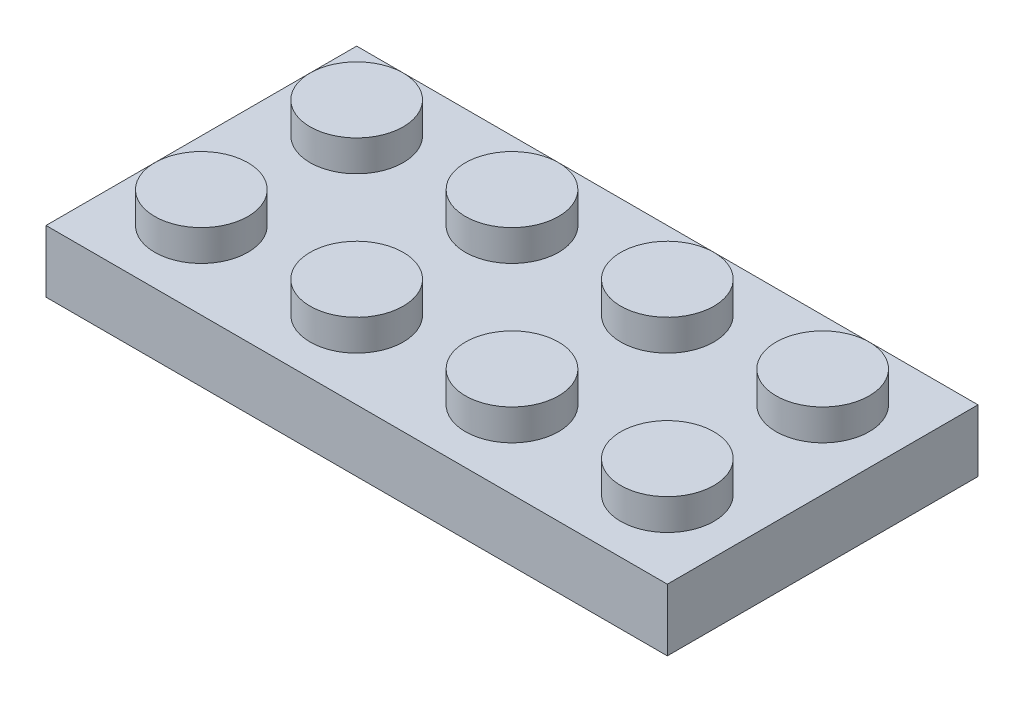
ISO-10303-21;
HEADER;
FILE_DESCRIPTION(('STEP AP214'),'2;1');
FILE_NAME('part.step','',(''),(''),'','','');
FILE_SCHEMA(('AUTOMOTIVE_DESIGN { 1 0 10303 214 1 1 1 1 }'));
ENDSEC;
DATA;
#1=APPLICATION_CONTEXT('core data for automotive mechanical design processes');
#2=APPLICATION_PROTOCOL_DEFINITION('international standard','automotive_design',2000,#1);
#3=PRODUCT_CONTEXT('',#1,'mechanical');
#4=PRODUCT('Part','Part','',(#3));
#5=PRODUCT_RELATED_PRODUCT_CATEGORY('part','',(#4));
#6=PRODUCT_DEFINITION_FORMATION('','',#4);
#7=PRODUCT_DEFINITION_CONTEXT('part definition',#1,'design');
#8=PRODUCT_DEFINITION('design','',#6,#7);
#9=PRODUCT_DEFINITION_SHAPE('','',#8);
#10=(LENGTH_UNIT() NAMED_UNIT(*) SI_UNIT(.MILLI.,.METRE.));
#11=(NAMED_UNIT(*) PLANE_ANGLE_UNIT() SI_UNIT($,.RADIAN.));
#12=(NAMED_UNIT(*) SI_UNIT($,.STERADIAN.) SOLID_ANGLE_UNIT());
#13=UNCERTAINTY_MEASURE_WITH_UNIT(LENGTH_MEASURE(1.E-05),#10,'distance_accuracy_value','');
#14=(GEOMETRIC_REPRESENTATION_CONTEXT(3) GLOBAL_UNCERTAINTY_ASSIGNED_CONTEXT((#13)) GLOBAL_UNIT_ASSIGNED_CONTEXT((#10,
#11,#12)) REPRESENTATION_CONTEXT('',''));
#15=CARTESIAN_POINT('',(0.,0.,0.));
#16=DIRECTION('',(0.,0.,1.));
#17=DIRECTION('',(1.,0.,0.));
#18=AXIS2_PLACEMENT_3D('',#15,#16,#17);
#19=CARTESIAN_POINT('',(28.,1.6,4.));
#20=DIRECTION('',(-1.,0.,0.));
#21=DIRECTION('',(0.,0.,1.));
#22=AXIS2_PLACEMENT_3D('',#19,#20,#21);
#23=PLANE('',#22);
#24=DIRECTION('',(0.,0.,-1.));
#25=VECTOR('',#24,1.);
#26=CARTESIAN_POINT('',(28.,0.,4.));
#27=LINE('',#26,#25);
#28=CARTESIAN_POINT('',(28.,0.,12.));
#29=VERTEX_POINT('',#28);
#30=CARTESIAN_POINT('',(28.,0.,-4.));
#31=VERTEX_POINT('',#30);
#32=EDGE_CURVE('E178',#29,#31,#27,.T.);
#33=ORIENTED_EDGE('',*,*,#32,.T.);
#34=DIRECTION('',(0.,-1.,0.));
#35=VECTOR('',#34,1.);
#36=CARTESIAN_POINT('',(28.,1.6,-4.));
#37=LINE('',#36,#35);
#38=CARTESIAN_POINT('',(28.,3.2,-4.));
#39=VERTEX_POINT('',#38);
#40=EDGE_CURVE('E202',#39,#31,#37,.T.);
#41=ORIENTED_EDGE('',*,*,#40,.F.);
#42=DIRECTION('',(0.,0.,-1.));
#43=VECTOR('',#42,1.);
#44=CARTESIAN_POINT('',(28.,3.2,4.));
#45=LINE('',#44,#43);
#46=CARTESIAN_POINT('',(28.,3.2,12.));
#47=VERTEX_POINT('',#46);
#48=EDGE_CURVE('E11',#47,#39,#45,.T.);
#49=ORIENTED_EDGE('',*,*,#48,.F.);
#50=DIRECTION('',(0.,1.,0.));
#51=VECTOR('',#50,1.);
#52=CARTESIAN_POINT('',(28.,1.6,12.));
#53=LINE('',#52,#51);
#54=EDGE_CURVE('E191',#29,#47,#53,.T.);
#55=ORIENTED_EDGE('',*,*,#54,.F.);
#56=EDGE_LOOP('',(#33,#41,#49,#55));
#57=FACE_BOUND('',#56,.T.);
#58=ADVANCED_FACE('F17',(#57),#23,.F.);
#59=CARTESIAN_POINT('',(12.,3.2,4.));
#60=DIRECTION('',(0.,-1.,0.));
#61=DIRECTION('',(0.,0.,-1.));
#62=AXIS2_PLACEMENT_3D('',#59,#60,#61);
#63=PLANE('',#62);
#64=ORIENTED_EDGE('',*,*,#48,.T.);
#65=DIRECTION('',(1.,0.,0.));
#66=VECTOR('',#65,1.);
#67=CARTESIAN_POINT('',(12.,3.2,-4.));
#68=LINE('',#67,#66);
#69=CARTESIAN_POINT('',(-4.,3.2,-4.));
#70=VERTEX_POINT('',#69);
#71=EDGE_CURVE('E21',#70,#39,#68,.T.);
#72=ORIENTED_EDGE('',*,*,#71,.F.);
#73=DIRECTION('',(0.,0.,-1.));
#74=VECTOR('',#73,1.);
#75=CARTESIAN_POINT('',(-4.,3.2,4.));
#76=LINE('',#75,#74);
#77=CARTESIAN_POINT('',(-4.,3.2,12.));
#78=VERTEX_POINT('',#77);
#79=EDGE_CURVE('E27',#78,#70,#76,.T.);
#80=ORIENTED_EDGE('',*,*,#79,.F.);
#81=DIRECTION('',(-1.,0.,0.));
#82=VECTOR('',#81,1.);
#83=CARTESIAN_POINT('',(12.,3.2,12.));
#84=LINE('',#83,#82);
#85=EDGE_CURVE('E174',#47,#78,#84,.T.);
#86=ORIENTED_EDGE('',*,*,#85,.F.);
#87=EDGE_LOOP('',(#64,#72,#80,#86));
#88=FACE_BOUND('',#87,.T.);
#89=CARTESIAN_POINT('',(0.,3.2,0.));
#90=DIRECTION('',(0.,-1.,0.));
#91=DIRECTION('',(1.,0.,0.));
#92=AXIS2_PLACEMENT_3D('',#89,#90,#91);
#93=CIRCLE('',#92,2.4);
#94=CARTESIAN_POINT('',(-2.4,3.2,0.));
#95=VERTEX_POINT('',#94);
#96=EDGE_CURVE('E193',#95,#95,#93,.T.);
#97=ORIENTED_EDGE('',*,*,#96,.T.);
#98=EDGE_LOOP('',(#97));
#99=FACE_BOUND('',#98,.T.);
#100=CARTESIAN_POINT('',(0.,3.2,8.));
#101=DIRECTION('',(0.,-1.,0.));
#102=DIRECTION('',(1.,0.,0.));
#103=AXIS2_PLACEMENT_3D('',#100,#101,#102);
#104=CIRCLE('',#103,2.4);
#105=CARTESIAN_POINT('',(-2.4,3.2,8.));
#106=VERTEX_POINT('',#105);
#107=EDGE_CURVE('E262',#106,#106,#104,.T.);
#108=ORIENTED_EDGE('',*,*,#107,.T.);
#109=EDGE_LOOP('',(#108));
#110=FACE_BOUND('',#109,.T.);
#111=CARTESIAN_POINT('',(8.,3.2,0.));
#112=DIRECTION('',(0.,-1.,0.));
#113=DIRECTION('',(1.,0.,0.));
#114=AXIS2_PLACEMENT_3D('',#111,#112,#113);
#115=CIRCLE('',#114,2.4);
#116=CARTESIAN_POINT('',(5.6,3.2,0.));
#117=VERTEX_POINT('',#116);
#118=EDGE_CURVE('E48',#117,#117,#115,.T.);
#119=ORIENTED_EDGE('',*,*,#118,.T.);
#120=EDGE_LOOP('',(#119));
#121=FACE_BOUND('',#120,.T.);
#122=CARTESIAN_POINT('',(8.,3.2,8.));
#123=DIRECTION('',(0.,-1.,0.));
#124=DIRECTION('',(1.,0.,0.));
#125=AXIS2_PLACEMENT_3D('',#122,#123,#124);
#126=CIRCLE('',#125,2.4);
#127=CARTESIAN_POINT('',(5.6,3.2,8.));
#128=VERTEX_POINT('',#127);
#129=EDGE_CURVE('E268',#128,#128,#126,.T.);
#130=ORIENTED_EDGE('',*,*,#129,.T.);
#131=EDGE_LOOP('',(#130));
#132=FACE_BOUND('',#131,.T.);
#133=CARTESIAN_POINT('',(16.,3.2,0.));
#134=DIRECTION('',(0.,-1.,0.));
#135=DIRECTION('',(1.,0.,0.));
#136=AXIS2_PLACEMENT_3D('',#133,#134,#135);
#137=CIRCLE('',#136,2.4);
#138=CARTESIAN_POINT('',(13.6,3.2,0.));
#139=VERTEX_POINT('',#138);
#140=EDGE_CURVE('E234',#139,#139,#137,.T.);
#141=ORIENTED_EDGE('',*,*,#140,.T.);
#142=EDGE_LOOP('',(#141));
#143=FACE_BOUND('',#142,.T.);
#144=CARTESIAN_POINT('',(16.,3.2,8.));
#145=DIRECTION('',(0.,-1.,0.));
#146=DIRECTION('',(1.,0.,0.));
#147=AXIS2_PLACEMENT_3D('',#144,#145,#146);
#148=CIRCLE('',#147,2.4);
#149=CARTESIAN_POINT('',(13.6,3.2,8.));
#150=VERTEX_POINT('',#149);
#151=EDGE_CURVE('E253',#150,#150,#148,.T.);
#152=ORIENTED_EDGE('',*,*,#151,.T.);
#153=EDGE_LOOP('',(#152));
#154=FACE_BOUND('',#153,.T.);
#155=CARTESIAN_POINT('',(24.,3.2,0.));
#156=DIRECTION('',(0.,-1.,0.));
#157=DIRECTION('',(1.,0.,0.));
#158=AXIS2_PLACEMENT_3D('',#155,#156,#157);
#159=CIRCLE('',#158,2.4);
#160=CARTESIAN_POINT('',(21.6,3.2,0.));
#161=VERTEX_POINT('',#160);
#162=EDGE_CURVE('E254',#161,#161,#159,.T.);
#163=ORIENTED_EDGE('',*,*,#162,.T.);
#164=EDGE_LOOP('',(#163));
#165=FACE_BOUND('',#164,.T.);
#166=CARTESIAN_POINT('',(24.,3.2,8.));
#167=DIRECTION('',(0.,-1.,0.));
#168=DIRECTION('',(1.,0.,0.));
#169=AXIS2_PLACEMENT_3D('',#166,#167,#168);
#170=CIRCLE('',#169,2.4);
#171=CARTESIAN_POINT('',(21.6,3.2,8.));
#172=VERTEX_POINT('',#171);
#173=EDGE_CURVE('E197',#172,#172,#170,.T.);
#174=ORIENTED_EDGE('',*,*,#173,.T.);
#175=EDGE_LOOP('',(#174));
#176=FACE_BOUND('',#175,.T.);
#177=ADVANCED_FACE('F171',(#88,#99,#110,#121,#132,#143,#154,#165,#176),#63,.F.);
#178=CARTESIAN_POINT('',(-4.,1.6,4.));
#179=DIRECTION('',(1.,0.,0.));
#180=DIRECTION('',(0.,0.,-1.));
#181=AXIS2_PLACEMENT_3D('',#178,#179,#180);
#182=PLANE('',#181);
#183=ORIENTED_EDGE('',*,*,#79,.T.);
#184=DIRECTION('',(0.,1.,0.));
#185=VECTOR('',#184,1.);
#186=CARTESIAN_POINT('',(-4.,1.6,-4.));
#187=LINE('',#186,#185);
#188=CARTESIAN_POINT('',(-4.,0.,-4.));
#189=VERTEX_POINT('',#188);
#190=EDGE_CURVE('E201',#189,#70,#187,.T.);
#191=ORIENTED_EDGE('',*,*,#190,.F.);
#192=DIRECTION('',(0.,0.,-1.));
#193=VECTOR('',#192,1.);
#194=CARTESIAN_POINT('',(-4.,0.,4.));
#195=LINE('',#194,#193);
#196=CARTESIAN_POINT('',(-4.,0.,12.));
#197=VERTEX_POINT('',#196);
#198=EDGE_CURVE('E183',#197,#189,#195,.T.);
#199=ORIENTED_EDGE('',*,*,#198,.F.);
#200=DIRECTION('',(0.,-1.,0.));
#201=VECTOR('',#200,1.);
#202=CARTESIAN_POINT('',(-4.,1.6,12.));
#203=LINE('',#202,#201);
#204=EDGE_CURVE('E181',#78,#197,#203,.T.);
#205=ORIENTED_EDGE('',*,*,#204,.F.);
#206=EDGE_LOOP('',(#183,#191,#199,#205));
#207=FACE_BOUND('',#206,.T.);
#208=ADVANCED_FACE('F182',(#207),#182,.F.);
#209=CARTESIAN_POINT('',(12.,0.,4.));
#210=DIRECTION('',(0.,1.,0.));
#211=DIRECTION('',(0.,0.,1.));
#212=AXIS2_PLACEMENT_3D('',#209,#210,#211);
#213=PLANE('',#212);
#214=ORIENTED_EDGE('',*,*,#198,.T.);
#215=DIRECTION('',(-1.,0.,0.));
#216=VECTOR('',#215,1.);
#217=CARTESIAN_POINT('',(12.,0.,-4.));
#218=LINE('',#217,#216);
#219=EDGE_CURVE('E199',#31,#189,#218,.T.);
#220=ORIENTED_EDGE('',*,*,#219,.F.);
#221=ORIENTED_EDGE('',*,*,#32,.F.);
#222=DIRECTION('',(1.,0.,0.));
#223=VECTOR('',#222,1.);
#224=CARTESIAN_POINT('',(12.,0.,12.));
#225=LINE('',#224,#223);
#226=EDGE_CURVE('E187',#197,#29,#225,.T.);
#227=ORIENTED_EDGE('',*,*,#226,.F.);
#228=EDGE_LOOP('',(#214,#220,#221,#227));
#229=FACE_BOUND('',#228,.T.);
#230=CARTESIAN_POINT('',(0.,0.,0.));
#231=DIRECTION('',(0.,1.,0.));
#232=DIRECTION('',(1.,0.,0.));
#233=AXIS2_PLACEMENT_3D('',#230,#231,#232);
#234=CIRCLE('',#233,2.4);
#235=CARTESIAN_POINT('',(-2.4,0.,0.));
#236=VERTEX_POINT('',#235);
#237=EDGE_CURVE('E226',#236,#236,#234,.T.);
#238=ORIENTED_EDGE('',*,*,#237,.T.);
#239=EDGE_LOOP('',(#238));
#240=FACE_BOUND('',#239,.T.);
#241=CARTESIAN_POINT('',(0.,0.,8.));
#242=DIRECTION('',(0.,1.,0.));
#243=DIRECTION('',(1.,0.,0.));
#244=AXIS2_PLACEMENT_3D('',#241,#242,#243);
#245=CIRCLE('',#244,2.4);
#246=CARTESIAN_POINT('',(-2.4,0.,8.));
#247=VERTEX_POINT('',#246);
#248=EDGE_CURVE('E222',#247,#247,#245,.T.);
#249=ORIENTED_EDGE('',*,*,#248,.T.);
#250=EDGE_LOOP('',(#249));
#251=FACE_BOUND('',#250,.T.);
#252=CARTESIAN_POINT('',(8.,0.,0.));
#253=DIRECTION('',(0.,1.,0.));
#254=DIRECTION('',(1.,0.,0.));
#255=AXIS2_PLACEMENT_3D('',#252,#253,#254);
#256=CIRCLE('',#255,2.4);
#257=CARTESIAN_POINT('',(5.6,0.,0.));
#258=VERTEX_POINT('',#257);
#259=EDGE_CURVE('E265',#258,#258,#256,.T.);
#260=ORIENTED_EDGE('',*,*,#259,.T.);
#261=EDGE_LOOP('',(#260));
#262=FACE_BOUND('',#261,.T.);
#263=CARTESIAN_POINT('',(8.,0.,8.));
#264=DIRECTION('',(0.,1.,0.));
#265=DIRECTION('',(1.,0.,0.));
#266=AXIS2_PLACEMENT_3D('',#263,#264,#265);
#267=CIRCLE('',#266,2.4);
#268=CARTESIAN_POINT('',(5.6,0.,8.));
#269=VERTEX_POINT('',#268);
#270=EDGE_CURVE('E210',#269,#269,#267,.T.);
#271=ORIENTED_EDGE('',*,*,#270,.T.);
#272=EDGE_LOOP('',(#271));
#273=FACE_BOUND('',#272,.T.);
#274=CARTESIAN_POINT('',(16.,0.,0.));
#275=DIRECTION('',(0.,1.,0.));
#276=DIRECTION('',(1.,0.,0.));
#277=AXIS2_PLACEMENT_3D('',#274,#275,#276);
#278=CIRCLE('',#277,2.4);
#279=CARTESIAN_POINT('',(13.6,0.,0.));
#280=VERTEX_POINT('',#279);
#281=EDGE_CURVE('E211',#280,#280,#278,.T.);
#282=ORIENTED_EDGE('',*,*,#281,.T.);
#283=EDGE_LOOP('',(#282));
#284=FACE_BOUND('',#283,.T.);
#285=CARTESIAN_POINT('',(16.,0.,8.));
#286=DIRECTION('',(0.,1.,0.));
#287=DIRECTION('',(1.,0.,0.));
#288=AXIS2_PLACEMENT_3D('',#285,#286,#287);
#289=CIRCLE('',#288,2.4);
#290=CARTESIAN_POINT('',(13.6,0.,8.));
#291=VERTEX_POINT('',#290);
#292=EDGE_CURVE('E204',#291,#291,#289,.T.);
#293=ORIENTED_EDGE('',*,*,#292,.T.);
#294=EDGE_LOOP('',(#293));
#295=FACE_BOUND('',#294,.T.);
#296=CARTESIAN_POINT('',(24.,0.,0.));
#297=DIRECTION('',(0.,1.,0.));
#298=DIRECTION('',(1.,0.,0.));
#299=AXIS2_PLACEMENT_3D('',#296,#297,#298);
#300=CIRCLE('',#299,2.4);
#301=CARTESIAN_POINT('',(21.6,0.,0.));
#302=VERTEX_POINT('',#301);
#303=EDGE_CURVE('E250',#302,#302,#300,.T.);
#304=ORIENTED_EDGE('',*,*,#303,.T.);
#305=EDGE_LOOP('',(#304));
#306=FACE_BOUND('',#305,.T.);
#307=CARTESIAN_POINT('',(24.,0.,8.));
#308=DIRECTION('',(0.,1.,0.));
#309=DIRECTION('',(1.,0.,0.));
#310=AXIS2_PLACEMENT_3D('',#307,#308,#309);
#311=CIRCLE('',#310,2.4);
#312=CARTESIAN_POINT('',(21.6,0.,8.));
#313=VERTEX_POINT('',#312);
#314=EDGE_CURVE('E230',#313,#313,#311,.T.);
#315=ORIENTED_EDGE('',*,*,#314,.T.);
#316=EDGE_LOOP('',(#315));
#317=FACE_BOUND('',#316,.T.);
#318=CARTESIAN_POINT('',(4.,0.,4.));
#319=DIRECTION('',(0.,1.,0.));
#320=DIRECTION('',(1.,0.,0.));
#321=AXIS2_PLACEMENT_3D('',#318,#319,#320);
#322=CIRCLE('',#321,2.4);
#323=CARTESIAN_POINT('',(1.6,0.,4.));
#324=VERTEX_POINT('',#323);
#325=EDGE_CURVE('E216',#324,#324,#322,.T.);
#326=ORIENTED_EDGE('',*,*,#325,.T.);
#327=EDGE_LOOP('',(#326));
#328=FACE_BOUND('',#327,.T.);
#329=CARTESIAN_POINT('',(12.,0.,4.));
#330=DIRECTION('',(0.,1.,0.));
#331=DIRECTION('',(1.,0.,0.));
#332=AXIS2_PLACEMENT_3D('',#329,#330,#331);
#333=CIRCLE('',#332,2.4);
#334=CARTESIAN_POINT('',(9.6,0.,4.));
#335=VERTEX_POINT('',#334);
#336=EDGE_CURVE('E212',#335,#335,#333,.T.);
#337=ORIENTED_EDGE('',*,*,#336,.T.);
#338=EDGE_LOOP('',(#337));
#339=FACE_BOUND('',#338,.T.);
#340=CARTESIAN_POINT('',(20.,0.,4.));
#341=DIRECTION('',(0.,1.,0.));
#342=DIRECTION('',(1.,0.,0.));
#343=AXIS2_PLACEMENT_3D('',#340,#341,#342);
#344=CIRCLE('',#343,2.4);
#345=CARTESIAN_POINT('',(17.6,0.,4.));
#346=VERTEX_POINT('',#345);
#347=EDGE_CURVE('E257',#346,#346,#344,.T.);
#348=ORIENTED_EDGE('',*,*,#347,.T.);
#349=EDGE_LOOP('',(#348));
#350=FACE_BOUND('',#349,.T.);
#351=ADVANCED_FACE('F390',(#229,#240,#251,#262,#273,#284,#295,#306,#317,#328,#339,#350),#213,.F.);
#352=CARTESIAN_POINT('',(12.,1.6,-4.));
#353=DIRECTION('',(0.,0.,1.));
#354=DIRECTION('',(1.,0.,0.));
#355=AXIS2_PLACEMENT_3D('',#352,#353,#354);
#356=PLANE('',#355);
#357=ORIENTED_EDGE('',*,*,#40,.T.);
#358=ORIENTED_EDGE('',*,*,#219,.T.);
#359=ORIENTED_EDGE('',*,*,#190,.T.);
#360=ORIENTED_EDGE('',*,*,#71,.T.);
#361=EDGE_LOOP('',(#357,#358,#359,#360));
#362=FACE_BOUND('',#361,.T.);
#363=ADVANCED_FACE('F393',(#362),#356,.F.);
#364=CARTESIAN_POINT('',(12.,1.6,12.));
#365=DIRECTION('',(0.,0.,1.));
#366=DIRECTION('',(1.,0.,0.));
#367=AXIS2_PLACEMENT_3D('',#364,#365,#366);
#368=PLANE('',#367);
#369=ORIENTED_EDGE('',*,*,#54,.T.);
#370=ORIENTED_EDGE('',*,*,#85,.T.);
#371=ORIENTED_EDGE('',*,*,#204,.T.);
#372=ORIENTED_EDGE('',*,*,#226,.T.);
#373=EDGE_LOOP('',(#369,#370,#371,#372));
#374=FACE_BOUND('',#373,.T.);
#375=ADVANCED_FACE('F189',(#374),#368,.T.);
#376=CARTESIAN_POINT('',(0.,4.8,0.));
#377=DIRECTION('',(0.,1.,0.));
#378=DIRECTION('',(1.,0.,0.));
#379=AXIS2_PLACEMENT_3D('',#376,#377,#378);
#380=PLANE('',#379);
#381=CARTESIAN_POINT('',(0.,4.8,0.));
#382=DIRECTION('',(0.,1.,0.));
#383=DIRECTION('',(1.,0.,0.));
#384=AXIS2_PLACEMENT_3D('',#381,#382,#383);
#385=CIRCLE('',#384,2.4);
#386=CARTESIAN_POINT('',(2.4,4.8,0.));
#387=VERTEX_POINT('',#386);
#388=EDGE_CURVE('E261',#387,#387,#385,.T.);
#389=ORIENTED_EDGE('',*,*,#388,.T.);
#390=EDGE_LOOP('',(#389));
#391=FACE_BOUND('',#390,.T.);
#392=ADVANCED_FACE('F451',(#391),#380,.T.);
#393=CARTESIAN_POINT('',(0.,3.75,0.));
#394=DIRECTION('',(0.,-1.,0.));
#395=DIRECTION('',(1.,0.,0.));
#396=AXIS2_PLACEMENT_3D('',#393,#394,#395);
#397=CYLINDRICAL_SURFACE('',#396,2.4);
#398=ORIENTED_EDGE('',*,*,#96,.F.);
#399=EDGE_LOOP('',(#398));
#400=FACE_BOUND('',#399,.T.);
#401=ORIENTED_EDGE('',*,*,#388,.F.);
#402=EDGE_LOOP('',(#401));
#403=FACE_BOUND('',#402,.T.);
#404=ADVANCED_FACE('F454',(#400,#403),#397,.T.);
#405=CARTESIAN_POINT('',(0.,4.8,8.));
#406=DIRECTION('',(0.,1.,0.));
#407=DIRECTION('',(1.,0.,0.));
#408=AXIS2_PLACEMENT_3D('',#405,#406,#407);
#409=PLANE('',#408);
#410=CARTESIAN_POINT('',(0.,4.8,8.));
#411=DIRECTION('',(0.,1.,0.));
#412=DIRECTION('',(1.,0.,0.));
#413=AXIS2_PLACEMENT_3D('',#410,#411,#412);
#414=CIRCLE('',#413,2.4);
#415=CARTESIAN_POINT('',(2.4,4.8,8.));
#416=VERTEX_POINT('',#415);
#417=EDGE_CURVE('E247',#416,#416,#414,.T.);
#418=ORIENTED_EDGE('',*,*,#417,.T.);
#419=EDGE_LOOP('',(#418));
#420=FACE_BOUND('',#419,.T.);
#421=ADVANCED_FACE('F449',(#420),#409,.T.);
#422=CARTESIAN_POINT('',(0.,3.75,8.));
#423=DIRECTION('',(0.,-1.,0.));
#424=DIRECTION('',(1.,0.,0.));
#425=AXIS2_PLACEMENT_3D('',#422,#423,#424);
#426=CYLINDRICAL_SURFACE('',#425,2.4);
#427=ORIENTED_EDGE('',*,*,#107,.F.);
#428=EDGE_LOOP('',(#427));
#429=FACE_BOUND('',#428,.T.);
#430=ORIENTED_EDGE('',*,*,#417,.F.);
#431=EDGE_LOOP('',(#430));
#432=FACE_BOUND('',#431,.T.);
#433=ADVANCED_FACE('F368',(#429,#432),#426,.T.);
#434=CARTESIAN_POINT('',(8.,4.8,0.));
#435=DIRECTION('',(0.,1.,0.));
#436=DIRECTION('',(1.,0.,0.));
#437=AXIS2_PLACEMENT_3D('',#434,#435,#436);
#438=PLANE('',#437);
#439=CARTESIAN_POINT('',(8.,4.8,0.));
#440=DIRECTION('',(0.,1.,0.));
#441=DIRECTION('',(1.,0.,0.));
#442=AXIS2_PLACEMENT_3D('',#439,#440,#441);
#443=CIRCLE('',#442,2.4);
#444=CARTESIAN_POINT('',(10.4,4.8,0.));
#445=VERTEX_POINT('',#444);
#446=EDGE_CURVE('E57',#445,#445,#443,.T.);
#447=ORIENTED_EDGE('',*,*,#446,.T.);
#448=EDGE_LOOP('',(#447));
#449=FACE_BOUND('',#448,.T.);
#450=ADVANCED_FACE('F360',(#449),#438,.T.);
#451=CARTESIAN_POINT('',(8.,3.75,0.));
#452=DIRECTION('',(0.,-1.,0.));
#453=DIRECTION('',(1.,0.,0.));
#454=AXIS2_PLACEMENT_3D('',#451,#452,#453);
#455=CYLINDRICAL_SURFACE('',#454,2.4);
#456=ORIENTED_EDGE('',*,*,#118,.F.);
#457=EDGE_LOOP('',(#456));
#458=FACE_BOUND('',#457,.T.);
#459=ORIENTED_EDGE('',*,*,#446,.F.);
#460=EDGE_LOOP('',(#459));
#461=FACE_BOUND('',#460,.T.);
#462=ADVANCED_FACE('F352',(#458,#461),#455,.T.);
#463=CARTESIAN_POINT('',(8.,4.8,8.));
#464=DIRECTION('',(0.,1.,0.));
#465=DIRECTION('',(1.,0.,0.));
#466=AXIS2_PLACEMENT_3D('',#463,#464,#465);
#467=PLANE('',#466);
#468=CARTESIAN_POINT('',(8.,4.8,8.));
#469=DIRECTION('',(0.,1.,0.));
#470=DIRECTION('',(1.,0.,0.));
#471=AXIS2_PLACEMENT_3D('',#468,#469,#470);
#472=CIRCLE('',#471,2.4);
#473=CARTESIAN_POINT('',(10.4,4.8,8.));
#474=VERTEX_POINT('',#473);
#475=EDGE_CURVE('E235',#474,#474,#472,.T.);
#476=ORIENTED_EDGE('',*,*,#475,.T.);
#477=EDGE_LOOP('',(#476));
#478=FACE_BOUND('',#477,.T.);
#479=ADVANCED_FACE('F349',(#478),#467,.T.);
#480=CARTESIAN_POINT('',(8.,3.75,8.));
#481=DIRECTION('',(0.,-1.,0.));
#482=DIRECTION('',(1.,0.,0.));
#483=AXIS2_PLACEMENT_3D('',#480,#481,#482);
#484=CYLINDRICAL_SURFACE('',#483,2.4);
#485=ORIENTED_EDGE('',*,*,#129,.F.);
#486=EDGE_LOOP('',(#485));
#487=FACE_BOUND('',#486,.T.);
#488=ORIENTED_EDGE('',*,*,#475,.F.);
#489=EDGE_LOOP('',(#488));
#490=FACE_BOUND('',#489,.T.);
#491=ADVANCED_FACE('F351',(#487,#490),#484,.T.);
#492=CARTESIAN_POINT('',(16.,4.8,0.));
#493=DIRECTION('',(0.,1.,0.));
#494=DIRECTION('',(1.,0.,0.));
#495=AXIS2_PLACEMENT_3D('',#492,#493,#494);
#496=PLANE('',#495);
#497=CARTESIAN_POINT('',(16.,4.8,0.));
#498=DIRECTION('',(0.,1.,0.));
#499=DIRECTION('',(1.,0.,0.));
#500=AXIS2_PLACEMENT_3D('',#497,#498,#499);
#501=CIRCLE('',#500,2.4);
#502=CARTESIAN_POINT('',(18.4,4.8,0.));
#503=VERTEX_POINT('',#502);
#504=EDGE_CURVE('E236',#503,#503,#501,.T.);
#505=ORIENTED_EDGE('',*,*,#504,.T.);
#506=EDGE_LOOP('',(#505));
#507=FACE_BOUND('',#506,.T.);
#508=ADVANCED_FACE('F309',(#507),#496,.T.);
#509=CARTESIAN_POINT('',(16.,3.75,0.));
#510=DIRECTION('',(0.,-1.,0.));
#511=DIRECTION('',(1.,0.,0.));
#512=AXIS2_PLACEMENT_3D('',#509,#510,#511);
#513=CYLINDRICAL_SURFACE('',#512,2.4);
#514=ORIENTED_EDGE('',*,*,#140,.F.);
#515=EDGE_LOOP('',(#514));
#516=FACE_BOUND('',#515,.T.);
#517=ORIENTED_EDGE('',*,*,#504,.F.);
#518=EDGE_LOOP('',(#517));
#519=FACE_BOUND('',#518,.T.);
#520=ADVANCED_FACE('F321',(#516,#519),#513,.T.);
#521=CARTESIAN_POINT('',(16.,4.8,8.));
#522=DIRECTION('',(0.,1.,0.));
#523=DIRECTION('',(1.,0.,0.));
#524=AXIS2_PLACEMENT_3D('',#521,#522,#523);
#525=PLANE('',#524);
#526=CARTESIAN_POINT('',(16.,4.8,8.));
#527=DIRECTION('',(0.,1.,0.));
#528=DIRECTION('',(1.,0.,0.));
#529=AXIS2_PLACEMENT_3D('',#526,#527,#528);
#530=CIRCLE('',#529,2.4);
#531=CARTESIAN_POINT('',(18.4,4.8,8.));
#532=VERTEX_POINT('',#531);
#533=EDGE_CURVE('E251',#532,#532,#530,.T.);
#534=ORIENTED_EDGE('',*,*,#533,.T.);
#535=EDGE_LOOP('',(#534));
#536=FACE_BOUND('',#535,.T.);
#537=ADVANCED_FACE('F317',(#536),#525,.T.);
#538=CARTESIAN_POINT('',(16.,3.75,8.));
#539=DIRECTION('',(0.,-1.,0.));
#540=DIRECTION('',(1.,0.,0.));
#541=AXIS2_PLACEMENT_3D('',#538,#539,#540);
#542=CYLINDRICAL_SURFACE('',#541,2.4);
#543=ORIENTED_EDGE('',*,*,#151,.F.);
#544=EDGE_LOOP('',(#543));
#545=FACE_BOUND('',#544,.T.);
#546=ORIENTED_EDGE('',*,*,#533,.F.);
#547=EDGE_LOOP('',(#546));
#548=FACE_BOUND('',#547,.T.);
#549=ADVANCED_FACE('F320',(#545,#548),#542,.T.);
#550=CARTESIAN_POINT('',(24.,4.8,0.));
#551=DIRECTION('',(0.,1.,0.));
#552=DIRECTION('',(1.,0.,0.));
#553=AXIS2_PLACEMENT_3D('',#550,#551,#552);
#554=PLANE('',#553);
#555=CARTESIAN_POINT('',(24.,4.8,0.));
#556=DIRECTION('',(0.,1.,0.));
#557=DIRECTION('',(1.,0.,0.));
#558=AXIS2_PLACEMENT_3D('',#555,#556,#557);
#559=CIRCLE('',#558,2.4);
#560=CARTESIAN_POINT('',(26.4,4.8,0.));
#561=VERTEX_POINT('',#560);
#562=EDGE_CURVE('E243',#561,#561,#559,.T.);
#563=ORIENTED_EDGE('',*,*,#562,.T.);
#564=EDGE_LOOP('',(#563));
#565=FACE_BOUND('',#564,.T.);
#566=ADVANCED_FACE('F323',(#565),#554,.T.);
#567=CARTESIAN_POINT('',(24.,3.75,0.));
#568=DIRECTION('',(0.,-1.,0.));
#569=DIRECTION('',(1.,0.,0.));
#570=AXIS2_PLACEMENT_3D('',#567,#568,#569);
#571=CYLINDRICAL_SURFACE('',#570,2.4);
#572=ORIENTED_EDGE('',*,*,#162,.F.);
#573=EDGE_LOOP('',(#572));
#574=FACE_BOUND('',#573,.T.);
#575=ORIENTED_EDGE('',*,*,#562,.F.);
#576=EDGE_LOOP('',(#575));
#577=FACE_BOUND('',#576,.T.);
#578=ADVANCED_FACE('F325',(#574,#577),#571,.T.);
#579=CARTESIAN_POINT('',(24.,4.8,8.));
#580=DIRECTION('',(0.,1.,0.));
#581=DIRECTION('',(1.,0.,0.));
#582=AXIS2_PLACEMENT_3D('',#579,#580,#581);
#583=PLANE('',#582);
#584=CARTESIAN_POINT('',(24.,4.8,8.));
#585=DIRECTION('',(0.,1.,0.));
#586=DIRECTION('',(1.,0.,0.));
#587=AXIS2_PLACEMENT_3D('',#584,#585,#586);
#588=CIRCLE('',#587,2.4);
#589=CARTESIAN_POINT('',(26.4,4.8,8.));
#590=VERTEX_POINT('',#589);
#591=EDGE_CURVE('E237',#590,#590,#588,.T.);
#592=ORIENTED_EDGE('',*,*,#591,.T.);
#593=EDGE_LOOP('',(#592));
#594=FACE_BOUND('',#593,.T.);
#595=ADVANCED_FACE('F428',(#594),#583,.T.);
#596=CARTESIAN_POINT('',(24.,3.75,8.));
#597=DIRECTION('',(0.,-1.,0.));
#598=DIRECTION('',(1.,0.,0.));
#599=AXIS2_PLACEMENT_3D('',#596,#597,#598);
#600=CYLINDRICAL_SURFACE('',#599,2.4);
#601=ORIENTED_EDGE('',*,*,#173,.F.);
#602=EDGE_LOOP('',(#601));
#603=FACE_BOUND('',#602,.T.);
#604=ORIENTED_EDGE('',*,*,#591,.F.);
#605=EDGE_LOOP('',(#604));
#606=FACE_BOUND('',#605,.T.);
#607=ADVANCED_FACE('F347',(#603,#606),#600,.T.);
#608=CARTESIAN_POINT('',(0.,1.6,0.));
#609=DIRECTION('',(0.,1.,0.));
#610=DIRECTION('',(1.,0.,0.));
#611=AXIS2_PLACEMENT_3D('',#608,#609,#610);
#612=PLANE('',#611);
#613=CARTESIAN_POINT('',(0.,1.6,0.));
#614=DIRECTION('',(0.,1.,0.));
#615=DIRECTION('',(1.,0.,0.));
#616=AXIS2_PLACEMENT_3D('',#613,#614,#615);
#617=CIRCLE('',#616,2.4);
#618=CARTESIAN_POINT('',(2.4,1.6,0.));
#619=VERTEX_POINT('',#618);
#620=EDGE_CURVE('E228',#619,#619,#617,.T.);
#621=ORIENTED_EDGE('',*,*,#620,.F.);
#622=EDGE_LOOP('',(#621));
#623=FACE_BOUND('',#622,.T.);
#624=ADVANCED_FACE('F344',(#623),#612,.F.);
#625=CARTESIAN_POINT('',(0.,0.55,0.));
#626=DIRECTION('',(0.,-1.,0.));
#627=DIRECTION('',(1.,0.,0.));
#628=AXIS2_PLACEMENT_3D('',#625,#626,#627);
#629=CYLINDRICAL_SURFACE('',#628,2.4);
#630=ORIENTED_EDGE('',*,*,#620,.T.);
#631=EDGE_LOOP('',(#630));
#632=FACE_BOUND('',#631,.T.);
#633=ORIENTED_EDGE('',*,*,#237,.F.);
#634=EDGE_LOOP('',(#633));
#635=FACE_BOUND('',#634,.T.);
#636=ADVANCED_FACE('F346',(#632,#635),#629,.F.);
#637=CARTESIAN_POINT('',(0.,1.6,8.));
#638=DIRECTION('',(0.,1.,0.));
#639=DIRECTION('',(1.,0.,0.));
#640=AXIS2_PLACEMENT_3D('',#637,#638,#639);
#641=PLANE('',#640);
#642=CARTESIAN_POINT('',(0.,1.6,8.));
#643=DIRECTION('',(0.,1.,0.));
#644=DIRECTION('',(1.,0.,0.));
#645=AXIS2_PLACEMENT_3D('',#642,#643,#644);
#646=CIRCLE('',#645,2.4);
#647=CARTESIAN_POINT('',(2.4,1.6,8.));
#648=VERTEX_POINT('',#647);
#649=EDGE_CURVE('E224',#648,#648,#646,.T.);
#650=ORIENTED_EDGE('',*,*,#649,.F.);
#651=EDGE_LOOP('',(#650));
#652=FACE_BOUND('',#651,.T.);
#653=ADVANCED_FACE('F342',(#652),#641,.F.);
#654=CARTESIAN_POINT('',(0.,0.55,8.));
#655=DIRECTION('',(0.,-1.,0.));
#656=DIRECTION('',(1.,0.,0.));
#657=AXIS2_PLACEMENT_3D('',#654,#655,#656);
#658=CYLINDRICAL_SURFACE('',#657,2.4);
#659=ORIENTED_EDGE('',*,*,#649,.T.);
#660=EDGE_LOOP('',(#659));
#661=FACE_BOUND('',#660,.T.);
#662=ORIENTED_EDGE('',*,*,#248,.F.);
#663=EDGE_LOOP('',(#662));
#664=FACE_BOUND('',#663,.T.);
#665=ADVANCED_FACE('F338',(#661,#664),#658,.F.);
#666=CARTESIAN_POINT('',(8.,1.6,0.));
#667=DIRECTION('',(0.,1.,0.));
#668=DIRECTION('',(1.,0.,0.));
#669=AXIS2_PLACEMENT_3D('',#666,#667,#668);
#670=PLANE('',#669);
#671=CARTESIAN_POINT('',(8.,1.6,0.));
#672=DIRECTION('',(0.,1.,0.));
#673=DIRECTION('',(1.,0.,0.));
#674=AXIS2_PLACEMENT_3D('',#671,#672,#673);
#675=CIRCLE('',#674,2.4);
#676=CARTESIAN_POINT('',(10.4,1.6,0.));
#677=VERTEX_POINT('',#676);
#678=EDGE_CURVE('E225',#677,#677,#675,.T.);
#679=ORIENTED_EDGE('',*,*,#678,.F.);
#680=EDGE_LOOP('',(#679));
#681=FACE_BOUND('',#680,.T.);
#682=ADVANCED_FACE('F341',(#681),#670,.F.);
#683=CARTESIAN_POINT('',(8.,0.55,0.));
#684=DIRECTION('',(0.,-1.,0.));
#685=DIRECTION('',(1.,0.,0.));
#686=AXIS2_PLACEMENT_3D('',#683,#684,#685);
#687=CYLINDRICAL_SURFACE('',#686,2.4);
#688=ORIENTED_EDGE('',*,*,#678,.T.);
#689=EDGE_LOOP('',(#688));
#690=FACE_BOUND('',#689,.T.);
#691=ORIENTED_EDGE('',*,*,#259,.F.);
#692=EDGE_LOOP('',(#691));
#693=FACE_BOUND('',#692,.T.);
#694=ADVANCED_FACE('F431',(#690,#693),#687,.F.);
#695=CARTESIAN_POINT('',(8.,1.6,8.));
#696=DIRECTION('',(0.,1.,0.));
#697=DIRECTION('',(1.,0.,0.));
#698=AXIS2_PLACEMENT_3D('',#695,#696,#697);
#699=PLANE('',#698);
#700=CARTESIAN_POINT('',(8.,1.6,8.));
#701=DIRECTION('',(0.,1.,0.));
#702=DIRECTION('',(1.,0.,0.));
#703=AXIS2_PLACEMENT_3D('',#700,#701,#702);
#704=CIRCLE('',#703,2.4);
#705=CARTESIAN_POINT('',(10.4,1.6,8.));
#706=VERTEX_POINT('',#705);
#707=EDGE_CURVE('E221',#706,#706,#704,.T.);
#708=ORIENTED_EDGE('',*,*,#707,.F.);
#709=EDGE_LOOP('',(#708));
#710=FACE_BOUND('',#709,.T.);
#711=ADVANCED_FACE('F436',(#710),#699,.F.);
#712=CARTESIAN_POINT('',(8.,0.55,8.));
#713=DIRECTION('',(0.,-1.,0.));
#714=DIRECTION('',(1.,0.,0.));
#715=AXIS2_PLACEMENT_3D('',#712,#713,#714);
#716=CYLINDRICAL_SURFACE('',#715,2.4);
#717=ORIENTED_EDGE('',*,*,#707,.T.);
#718=EDGE_LOOP('',(#717));
#719=FACE_BOUND('',#718,.T.);
#720=ORIENTED_EDGE('',*,*,#270,.F.);
#721=EDGE_LOOP('',(#720));
#722=FACE_BOUND('',#721,.T.);
#723=ADVANCED_FACE('F443',(#719,#722),#716,.F.);
#724=CARTESIAN_POINT('',(16.,1.6,0.));
#725=DIRECTION('',(0.,1.,0.));
#726=DIRECTION('',(1.,0.,0.));
#727=AXIS2_PLACEMENT_3D('',#724,#725,#726);
#728=PLANE('',#727);
#729=CARTESIAN_POINT('',(16.,1.6,0.));
#730=DIRECTION('',(0.,1.,0.));
#731=DIRECTION('',(1.,0.,0.));
#732=AXIS2_PLACEMENT_3D('',#729,#730,#731);
#733=CIRCLE('',#732,2.4);
#734=CARTESIAN_POINT('',(18.4,1.6,0.));
#735=VERTEX_POINT('',#734);
#736=EDGE_CURVE('E208',#735,#735,#733,.T.);
#737=ORIENTED_EDGE('',*,*,#736,.F.);
#738=EDGE_LOOP('',(#737));
#739=FACE_BOUND('',#738,.T.);
#740=ADVANCED_FACE('F461',(#739),#728,.F.);
#741=CARTESIAN_POINT('',(16.,0.55,0.));
#742=DIRECTION('',(0.,-1.,0.));
#743=DIRECTION('',(1.,0.,0.));
#744=AXIS2_PLACEMENT_3D('',#741,#742,#743);
#745=CYLINDRICAL_SURFACE('',#744,2.4);
#746=ORIENTED_EDGE('',*,*,#736,.T.);
#747=EDGE_LOOP('',(#746));
#748=FACE_BOUND('',#747,.T.);
#749=ORIENTED_EDGE('',*,*,#281,.F.);
#750=EDGE_LOOP('',(#749));
#751=FACE_BOUND('',#750,.T.);
#752=ADVANCED_FACE('F332',(#748,#751),#745,.F.);
#753=CARTESIAN_POINT('',(16.,1.6,8.));
#754=DIRECTION('',(0.,1.,0.));
#755=DIRECTION('',(1.,0.,0.));
#756=AXIS2_PLACEMENT_3D('',#753,#754,#755);
#757=PLANE('',#756);
#758=CARTESIAN_POINT('',(16.,1.6,8.));
#759=DIRECTION('',(0.,1.,0.));
#760=DIRECTION('',(1.,0.,0.));
#761=AXIS2_PLACEMENT_3D('',#758,#759,#760);
#762=CIRCLE('',#761,2.4);
#763=CARTESIAN_POINT('',(18.4,1.6,8.));
#764=VERTEX_POINT('',#763);
#765=EDGE_CURVE('E206',#764,#764,#762,.T.);
#766=ORIENTED_EDGE('',*,*,#765,.F.);
#767=EDGE_LOOP('',(#766));
#768=FACE_BOUND('',#767,.T.);
#769=ADVANCED_FACE('F328',(#768),#757,.F.);
#770=CARTESIAN_POINT('',(16.,0.55,8.));
#771=DIRECTION('',(0.,-1.,0.));
#772=DIRECTION('',(1.,0.,0.));
#773=AXIS2_PLACEMENT_3D('',#770,#771,#772);
#774=CYLINDRICAL_SURFACE('',#773,2.4);
#775=ORIENTED_EDGE('',*,*,#765,.T.);
#776=EDGE_LOOP('',(#775));
#777=FACE_BOUND('',#776,.T.);
#778=ORIENTED_EDGE('',*,*,#292,.F.);
#779=EDGE_LOOP('',(#778));
#780=FACE_BOUND('',#779,.T.);
#781=ADVANCED_FACE('F331',(#777,#780),#774,.F.);
#782=CARTESIAN_POINT('',(24.,1.6,0.));
#783=DIRECTION('',(0.,1.,0.));
#784=DIRECTION('',(1.,0.,0.));
#785=AXIS2_PLACEMENT_3D('',#782,#783,#784);
#786=PLANE('',#785);
#787=CARTESIAN_POINT('',(24.,1.6,0.));
#788=DIRECTION('',(0.,1.,0.));
#789=DIRECTION('',(1.,0.,0.));
#790=AXIS2_PLACEMENT_3D('',#787,#788,#789);
#791=CIRCLE('',#790,2.4);
#792=CARTESIAN_POINT('',(26.4,1.6,0.));
#793=VERTEX_POINT('',#792);
#794=EDGE_CURVE('E207',#793,#793,#791,.T.);
#795=ORIENTED_EDGE('',*,*,#794,.F.);
#796=EDGE_LOOP('',(#795));
#797=FACE_BOUND('',#796,.T.);
#798=ADVANCED_FACE('F315',(#797),#786,.F.);
#799=CARTESIAN_POINT('',(24.,0.55,0.));
#800=DIRECTION('',(0.,-1.,0.));
#801=DIRECTION('',(1.,0.,0.));
#802=AXIS2_PLACEMENT_3D('',#799,#800,#801);
#803=CYLINDRICAL_SURFACE('',#802,2.4);
#804=ORIENTED_EDGE('',*,*,#794,.T.);
#805=EDGE_LOOP('',(#804));
#806=FACE_BOUND('',#805,.T.);
#807=ORIENTED_EDGE('',*,*,#303,.F.);
#808=EDGE_LOOP('',(#807));
#809=FACE_BOUND('',#808,.T.);
#810=ADVANCED_FACE('F312',(#806,#809),#803,.F.);
#811=CARTESIAN_POINT('',(24.,1.6,8.));
#812=DIRECTION('',(0.,1.,0.));
#813=DIRECTION('',(1.,0.,0.));
#814=AXIS2_PLACEMENT_3D('',#811,#812,#813);
#815=PLANE('',#814);
#816=CARTESIAN_POINT('',(24.,1.6,8.));
#817=DIRECTION('',(0.,1.,0.));
#818=DIRECTION('',(1.,0.,0.));
#819=AXIS2_PLACEMENT_3D('',#816,#817,#818);
#820=CIRCLE('',#819,2.4);
#821=CARTESIAN_POINT('',(26.4,1.6,8.));
#822=VERTEX_POINT('',#821);
#823=EDGE_CURVE('E233',#822,#822,#820,.T.);
#824=ORIENTED_EDGE('',*,*,#823,.F.);
#825=EDGE_LOOP('',(#824));
#826=FACE_BOUND('',#825,.T.);
#827=ADVANCED_FACE('F19',(#826),#815,.F.);
#828=CARTESIAN_POINT('',(24.,0.55,8.));
#829=DIRECTION('',(0.,-1.,0.));
#830=DIRECTION('',(1.,0.,0.));
#831=AXIS2_PLACEMENT_3D('',#828,#829,#830);
#832=CYLINDRICAL_SURFACE('',#831,2.4);
#833=ORIENTED_EDGE('',*,*,#823,.T.);
#834=EDGE_LOOP('',(#833));
#835=FACE_BOUND('',#834,.T.);
#836=ORIENTED_EDGE('',*,*,#314,.F.);
#837=EDGE_LOOP('',(#836));
#838=FACE_BOUND('',#837,.T.);
#839=ADVANCED_FACE('F416',(#835,#838),#832,.F.);
#840=CARTESIAN_POINT('',(4.,1.6,4.));
#841=DIRECTION('',(0.,1.,0.));
#842=DIRECTION('',(1.,0.,0.));
#843=AXIS2_PLACEMENT_3D('',#840,#841,#842);
#844=PLANE('',#843);
#845=CARTESIAN_POINT('',(4.,1.6,4.));
#846=DIRECTION('',(0.,1.,0.));
#847=DIRECTION('',(1.,0.,0.));
#848=AXIS2_PLACEMENT_3D('',#845,#846,#847);
#849=CIRCLE('',#848,2.4);
#850=CARTESIAN_POINT('',(6.4,1.6,4.));
#851=VERTEX_POINT('',#850);
#852=EDGE_CURVE('E219',#851,#851,#849,.T.);
#853=ORIENTED_EDGE('',*,*,#852,.F.);
#854=EDGE_LOOP('',(#853));
#855=FACE_BOUND('',#854,.T.);
#856=ADVANCED_FACE('F378',(#855),#844,.F.);
#857=CARTESIAN_POINT('',(4.,0.55,4.));
#858=DIRECTION('',(0.,-1.,0.));
#859=DIRECTION('',(1.,0.,0.));
#860=AXIS2_PLACEMENT_3D('',#857,#858,#859);
#861=CYLINDRICAL_SURFACE('',#860,2.4);
#862=ORIENTED_EDGE('',*,*,#852,.T.);
#863=EDGE_LOOP('',(#862));
#864=FACE_BOUND('',#863,.T.);
#865=ORIENTED_EDGE('',*,*,#325,.F.);
#866=EDGE_LOOP('',(#865));
#867=FACE_BOUND('',#866,.T.);
#868=ADVANCED_FACE('F336',(#864,#867),#861,.F.);
#869=CARTESIAN_POINT('',(12.,1.6,4.));
#870=DIRECTION('',(0.,1.,0.));
#871=DIRECTION('',(1.,0.,0.));
#872=AXIS2_PLACEMENT_3D('',#869,#870,#871);
#873=PLANE('',#872);
#874=CARTESIAN_POINT('',(12.,1.6,4.));
#875=DIRECTION('',(0.,1.,0.));
#876=DIRECTION('',(1.,0.,0.));
#877=AXIS2_PLACEMENT_3D('',#874,#875,#876);
#878=CIRCLE('',#877,2.4);
#879=CARTESIAN_POINT('',(14.4,1.6,4.));
#880=VERTEX_POINT('',#879);
#881=EDGE_CURVE('E214',#880,#880,#878,.T.);
#882=ORIENTED_EDGE('',*,*,#881,.F.);
#883=EDGE_LOOP('',(#882));
#884=FACE_BOUND('',#883,.T.);
#885=ADVANCED_FACE('F295',(#884),#873,.F.);
#886=CARTESIAN_POINT('',(12.,0.55,4.));
#887=DIRECTION('',(0.,-1.,0.));
#888=DIRECTION('',(1.,0.,0.));
#889=AXIS2_PLACEMENT_3D('',#886,#887,#888);
#890=CYLINDRICAL_SURFACE('',#889,2.4);
#891=ORIENTED_EDGE('',*,*,#881,.T.);
#892=EDGE_LOOP('',(#891));
#893=FACE_BOUND('',#892,.T.);
#894=ORIENTED_EDGE('',*,*,#336,.F.);
#895=EDGE_LOOP('',(#894));
#896=FACE_BOUND('',#895,.T.);
#897=ADVANCED_FACE('F287',(#893,#896),#890,.F.);
#898=CARTESIAN_POINT('',(20.,1.6,4.));
#899=DIRECTION('',(0.,1.,0.));
#900=DIRECTION('',(1.,0.,0.));
#901=AXIS2_PLACEMENT_3D('',#898,#899,#900);
#902=PLANE('',#901);
#903=CARTESIAN_POINT('',(20.,1.6,4.));
#904=DIRECTION('',(0.,1.,0.));
#905=DIRECTION('',(1.,0.,0.));
#906=AXIS2_PLACEMENT_3D('',#903,#904,#905);
#907=CIRCLE('',#906,2.4);
#908=CARTESIAN_POINT('',(22.4,1.6,4.));
#909=VERTEX_POINT('',#908);
#910=EDGE_CURVE('E215',#909,#909,#907,.T.);
#911=ORIENTED_EDGE('',*,*,#910,.F.);
#912=EDGE_LOOP('',(#911));
#913=FACE_BOUND('',#912,.T.);
#914=ADVANCED_FACE('F285',(#913),#902,.F.);
#915=CARTESIAN_POINT('',(20.,0.55,4.));
#916=DIRECTION('',(0.,-1.,0.));
#917=DIRECTION('',(1.,0.,0.));
#918=AXIS2_PLACEMENT_3D('',#915,#916,#917);
#919=CYLINDRICAL_SURFACE('',#918,2.4);
#920=ORIENTED_EDGE('',*,*,#910,.T.);
#921=EDGE_LOOP('',(#920));
#922=FACE_BOUND('',#921,.T.);
#923=ORIENTED_EDGE('',*,*,#347,.F.);
#924=EDGE_LOOP('',(#923));
#925=FACE_BOUND('',#924,.T.);
#926=ADVANCED_FACE('F282',(#922,#925),#919,.F.);
#927=CLOSED_SHELL('',(#58,#177,#208,#351,#363,#375,#392,#404,#421,#433,#450,#462,#479,#491,#508,
#520,#537,#549,#566,#578,#595,#607,#624,#636,#653,#665,#682,#694,#711,#723,#740,#752,#769,#781,
#798,#810,#827,#839,#856,#868,#885,#897,#914,#926));
#928=MANIFOLD_SOLID_BREP('B1',#927);
#929=ADVANCED_BREP_SHAPE_REPRESENTATION('',(#18,#928),#14);
#930=SHAPE_DEFINITION_REPRESENTATION(#9,#929);
ENDSEC;
END-ISO-10303-21;
